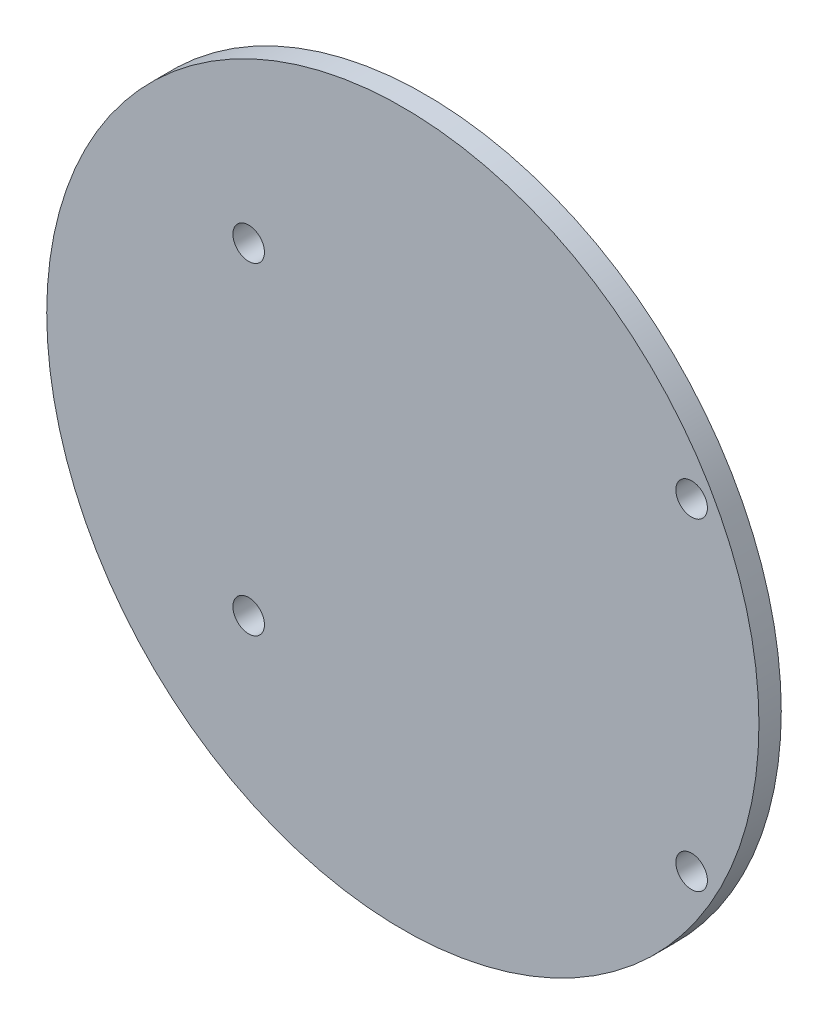
ISO-10303-21;
HEADER;
FILE_DESCRIPTION(('STEP AP214'),'2;1');
FILE_NAME('part.step','',(''),(''),'','','');
FILE_SCHEMA(('AUTOMOTIVE_DESIGN { 1 0 10303 214 1 1 1 1 }'));
ENDSEC;
DATA;
#1=APPLICATION_CONTEXT('core data for automotive mechanical design processes');
#2=APPLICATION_PROTOCOL_DEFINITION('international standard','automotive_design',2000,#1);
#3=PRODUCT_CONTEXT('',#1,'mechanical');
#4=PRODUCT('Part','Part','',(#3));
#5=PRODUCT_RELATED_PRODUCT_CATEGORY('part','',(#4));
#6=PRODUCT_DEFINITION_FORMATION('','',#4);
#7=PRODUCT_DEFINITION_CONTEXT('part definition',#1,'design');
#8=PRODUCT_DEFINITION('design','',#6,#7);
#9=PRODUCT_DEFINITION_SHAPE('','',#8);
#10=(LENGTH_UNIT() NAMED_UNIT(*) SI_UNIT(.MILLI.,.METRE.));
#11=(NAMED_UNIT(*) PLANE_ANGLE_UNIT() SI_UNIT($,.RADIAN.));
#12=(NAMED_UNIT(*) SI_UNIT($,.STERADIAN.) SOLID_ANGLE_UNIT());
#13=UNCERTAINTY_MEASURE_WITH_UNIT(LENGTH_MEASURE(1.E-05),#10,'distance_accuracy_value','');
#14=(GEOMETRIC_REPRESENTATION_CONTEXT(3) GLOBAL_UNCERTAINTY_ASSIGNED_CONTEXT((#13)) GLOBAL_UNIT_ASSIGNED_CONTEXT((#10,
#11,#12)) REPRESENTATION_CONTEXT('',''));
#15=CARTESIAN_POINT('',(0.,0.,0.));
#16=DIRECTION('',(0.,0.,1.));
#17=DIRECTION('',(1.,0.,0.));
#18=AXIS2_PLACEMENT_3D('',#15,#16,#17);
#19=CARTESIAN_POINT('',(27.94,27.94,1.6));
#20=DIRECTION('',(0.,0.,1.));
#21=DIRECTION('',(1.,0.,0.));
#22=AXIS2_PLACEMENT_3D('',#19,#20,#21);
#23=PLANE('',#22);
#24=CARTESIAN_POINT('',(16.89,39.5,1.6));
#25=DIRECTION('',(0.,0.,1.));
#26=DIRECTION('',(1.,0.,0.));
#27=AXIS2_PLACEMENT_3D('',#24,#25,#26);
#28=CIRCLE('',#27,1.13);
#29=CARTESIAN_POINT('',(18.02,39.5,1.6));
#30=VERTEX_POINT('',#29);
#31=EDGE_CURVE('E53',#30,#30,#28,.T.);
#32=ORIENTED_EDGE('',*,*,#31,.F.);
#33=EDGE_LOOP('',(#32));
#34=FACE_BOUND('',#33,.T.);
#35=CARTESIAN_POINT('',(48.64,39.5,1.6));
#36=DIRECTION('',(0.,0.,1.));
#37=DIRECTION('',(1.,0.,0.));
#38=AXIS2_PLACEMENT_3D('',#35,#36,#37);
#39=CIRCLE('',#38,1.13);
#40=CARTESIAN_POINT('',(49.77,39.5,1.6));
#41=VERTEX_POINT('',#40);
#42=EDGE_CURVE('E42',#41,#41,#39,.T.);
#43=ORIENTED_EDGE('',*,*,#42,.F.);
#44=EDGE_LOOP('',(#43));
#45=FACE_BOUND('',#44,.T.);
#46=CARTESIAN_POINT('',(27.94,27.94,1.6));
#47=DIRECTION('',(0.,0.,1.));
#48=DIRECTION('',(1.,0.,0.));
#49=AXIS2_PLACEMENT_3D('',#46,#47,#48);
#50=CIRCLE('',#49,25.527);
#51=CARTESIAN_POINT('',(53.467,27.94,1.6));
#52=VERTEX_POINT('',#51);
#53=EDGE_CURVE('E10',#52,#52,#50,.T.);
#54=ORIENTED_EDGE('',*,*,#53,.T.);
#55=EDGE_LOOP('',(#54));
#56=FACE_BOUND('',#55,.T.);
#57=CARTESIAN_POINT('',(48.64,16.38,1.6));
#58=DIRECTION('',(0.,0.,1.));
#59=DIRECTION('',(1.,0.,0.));
#60=AXIS2_PLACEMENT_3D('',#57,#58,#59);
#61=CIRCLE('',#60,1.13);
#62=CARTESIAN_POINT('',(49.77,16.38,1.6));
#63=VERTEX_POINT('',#62);
#64=EDGE_CURVE('E47',#63,#63,#61,.T.);
#65=ORIENTED_EDGE('',*,*,#64,.F.);
#66=EDGE_LOOP('',(#65));
#67=FACE_BOUND('',#66,.T.);
#68=CARTESIAN_POINT('',(16.89,16.38,1.6));
#69=DIRECTION('',(0.,0.,1.));
#70=DIRECTION('',(1.,0.,0.));
#71=AXIS2_PLACEMENT_3D('',#68,#69,#70);
#72=CIRCLE('',#71,1.13);
#73=CARTESIAN_POINT('',(18.02,16.38,1.6));
#74=VERTEX_POINT('',#73);
#75=EDGE_CURVE('E59',#74,#74,#72,.T.);
#76=ORIENTED_EDGE('',*,*,#75,.F.);
#77=EDGE_LOOP('',(#76));
#78=FACE_BOUND('',#77,.T.);
#79=ADVANCED_FACE('F31',(#34,#45,#56,#67,#78),#23,.T.);
#80=CARTESIAN_POINT('',(27.94,27.94,0.));
#81=DIRECTION('',(0.,0.,1.));
#82=DIRECTION('',(1.,0.,0.));
#83=AXIS2_PLACEMENT_3D('',#80,#81,#82);
#84=PLANE('',#83);
#85=CARTESIAN_POINT('',(16.89,39.5,0.));
#86=DIRECTION('',(0.,0.,1.));
#87=DIRECTION('',(1.,0.,0.));
#88=AXIS2_PLACEMENT_3D('',#85,#86,#87);
#89=CIRCLE('',#88,1.13);
#90=CARTESIAN_POINT('',(18.02,39.5,0.));
#91=VERTEX_POINT('',#90);
#92=EDGE_CURVE('E56',#91,#91,#89,.T.);
#93=ORIENTED_EDGE('',*,*,#92,.T.);
#94=EDGE_LOOP('',(#93));
#95=FACE_BOUND('',#94,.T.);
#96=CARTESIAN_POINT('',(48.64,39.5,0.));
#97=DIRECTION('',(0.,0.,1.));
#98=DIRECTION('',(1.,0.,0.));
#99=AXIS2_PLACEMENT_3D('',#96,#97,#98);
#100=CIRCLE('',#99,1.13);
#101=CARTESIAN_POINT('',(49.77,39.5,0.));
#102=VERTEX_POINT('',#101);
#103=EDGE_CURVE('E44',#102,#102,#100,.T.);
#104=ORIENTED_EDGE('',*,*,#103,.T.);
#105=EDGE_LOOP('',(#104));
#106=FACE_BOUND('',#105,.T.);
#107=CARTESIAN_POINT('',(27.94,27.94,0.));
#108=DIRECTION('',(0.,0.,1.));
#109=DIRECTION('',(1.,0.,0.));
#110=AXIS2_PLACEMENT_3D('',#107,#108,#109);
#111=CIRCLE('',#110,25.527);
#112=CARTESIAN_POINT('',(53.467,27.94,0.));
#113=VERTEX_POINT('',#112);
#114=EDGE_CURVE('E35',#113,#113,#111,.T.);
#115=ORIENTED_EDGE('',*,*,#114,.F.);
#116=EDGE_LOOP('',(#115));
#117=FACE_BOUND('',#116,.T.);
#118=CARTESIAN_POINT('',(48.64,16.38,0.));
#119=DIRECTION('',(0.,0.,1.));
#120=DIRECTION('',(1.,0.,0.));
#121=AXIS2_PLACEMENT_3D('',#118,#119,#120);
#122=CIRCLE('',#121,1.13);
#123=CARTESIAN_POINT('',(49.77,16.38,0.));
#124=VERTEX_POINT('',#123);
#125=EDGE_CURVE('E50',#124,#124,#122,.T.);
#126=ORIENTED_EDGE('',*,*,#125,.T.);
#127=EDGE_LOOP('',(#126));
#128=FACE_BOUND('',#127,.T.);
#129=CARTESIAN_POINT('',(16.89,16.38,0.));
#130=DIRECTION('',(0.,0.,1.));
#131=DIRECTION('',(1.,0.,0.));
#132=AXIS2_PLACEMENT_3D('',#129,#130,#131);
#133=CIRCLE('',#132,1.13);
#134=CARTESIAN_POINT('',(18.02,16.38,0.));
#135=VERTEX_POINT('',#134);
#136=EDGE_CURVE('E62',#135,#135,#133,.T.);
#137=ORIENTED_EDGE('',*,*,#136,.T.);
#138=EDGE_LOOP('',(#137));
#139=FACE_BOUND('',#138,.T.);
#140=ADVANCED_FACE('F72',(#95,#106,#117,#128,#139),#84,.F.);
#141=CARTESIAN_POINT('',(27.94,27.94,1.6));
#142=DIRECTION('',(0.,0.,-1.));
#143=DIRECTION('',(-1.,0.,0.));
#144=AXIS2_PLACEMENT_3D('',#141,#142,#143);
#145=CYLINDRICAL_SURFACE('',#144,25.527);
#146=ORIENTED_EDGE('',*,*,#53,.F.);
#147=EDGE_LOOP('',(#146));
#148=FACE_BOUND('',#147,.T.);
#149=ORIENTED_EDGE('',*,*,#114,.T.);
#150=EDGE_LOOP('',(#149));
#151=FACE_BOUND('',#150,.T.);
#152=ADVANCED_FACE('F33',(#148,#151),#145,.T.);
#153=CARTESIAN_POINT('',(48.64,39.5,1.6));
#154=DIRECTION('',(0.,0.,-1.));
#155=DIRECTION('',(-1.,0.,0.));
#156=AXIS2_PLACEMENT_3D('',#153,#154,#155);
#157=CYLINDRICAL_SURFACE('',#156,1.13);
#158=ORIENTED_EDGE('',*,*,#42,.T.);
#159=EDGE_LOOP('',(#158));
#160=FACE_BOUND('',#159,.T.);
#161=ORIENTED_EDGE('',*,*,#103,.F.);
#162=EDGE_LOOP('',(#161));
#163=FACE_BOUND('',#162,.T.);
#164=ADVANCED_FACE('F82',(#160,#163),#157,.F.);
#165=CARTESIAN_POINT('',(48.64,16.38,1.6));
#166=DIRECTION('',(0.,0.,-1.));
#167=DIRECTION('',(-1.,0.,0.));
#168=AXIS2_PLACEMENT_3D('',#165,#166,#167);
#169=CYLINDRICAL_SURFACE('',#168,1.13);
#170=ORIENTED_EDGE('',*,*,#64,.T.);
#171=EDGE_LOOP('',(#170));
#172=FACE_BOUND('',#171,.T.);
#173=ORIENTED_EDGE('',*,*,#125,.F.);
#174=EDGE_LOOP('',(#173));
#175=FACE_BOUND('',#174,.T.);
#176=ADVANCED_FACE('F85',(#172,#175),#169,.F.);
#177=CARTESIAN_POINT('',(16.89,39.5,1.6));
#178=DIRECTION('',(0.,0.,-1.));
#179=DIRECTION('',(-1.,0.,0.));
#180=AXIS2_PLACEMENT_3D('',#177,#178,#179);
#181=CYLINDRICAL_SURFACE('',#180,1.13);
#182=ORIENTED_EDGE('',*,*,#31,.T.);
#183=EDGE_LOOP('',(#182));
#184=FACE_BOUND('',#183,.T.);
#185=ORIENTED_EDGE('',*,*,#92,.F.);
#186=EDGE_LOOP('',(#185));
#187=FACE_BOUND('',#186,.T.);
#188=ADVANCED_FACE('F89',(#184,#187),#181,.F.);
#189=CARTESIAN_POINT('',(16.89,16.38,1.6));
#190=DIRECTION('',(0.,0.,-1.));
#191=DIRECTION('',(-1.,0.,0.));
#192=AXIS2_PLACEMENT_3D('',#189,#190,#191);
#193=CYLINDRICAL_SURFACE('',#192,1.13);
#194=ORIENTED_EDGE('',*,*,#75,.T.);
#195=EDGE_LOOP('',(#194));
#196=FACE_BOUND('',#195,.T.);
#197=ORIENTED_EDGE('',*,*,#136,.F.);
#198=EDGE_LOOP('',(#197));
#199=FACE_BOUND('',#198,.T.);
#200=ADVANCED_FACE('F68',(#196,#199),#193,.F.);
#201=CLOSED_SHELL('',(#79,#140,#152,#164,#176,#188,#200));
#202=MANIFOLD_SOLID_BREP('B2',#201);
#203=ADVANCED_BREP_SHAPE_REPRESENTATION('',(#18,#202),#14);
#204=SHAPE_DEFINITION_REPRESENTATION(#9,#203);
ENDSEC;
END-ISO-10303-21;
